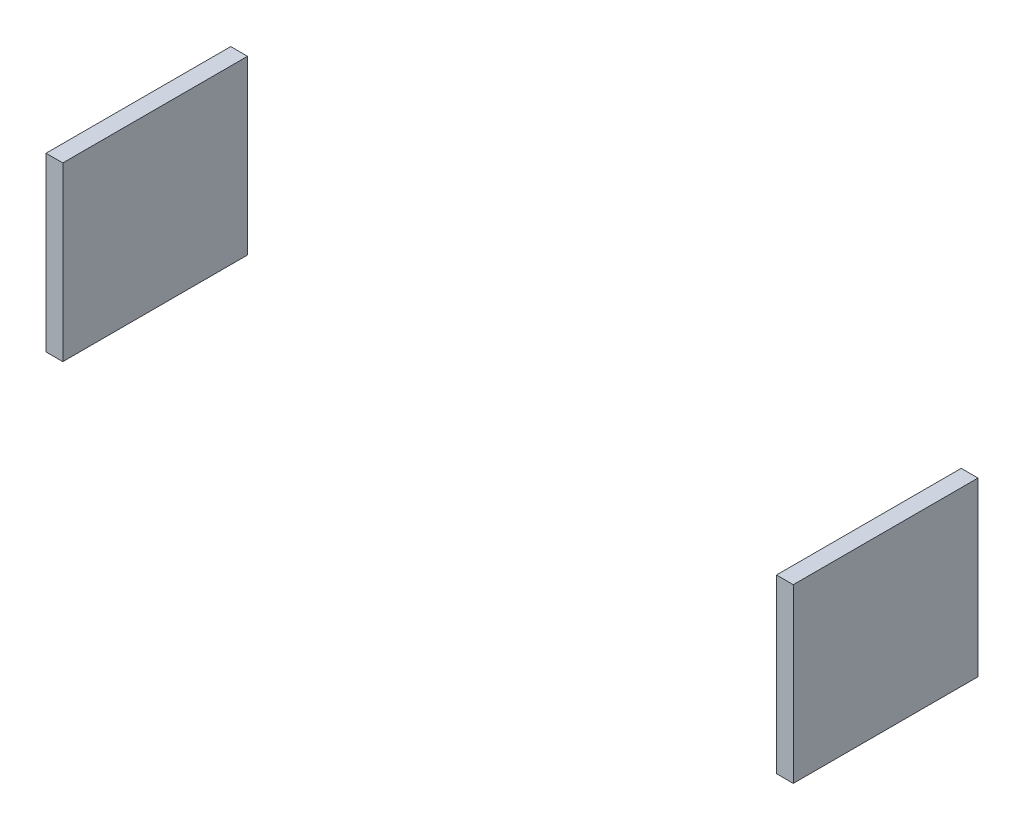
ISO-10303-21;
HEADER;
FILE_DESCRIPTION(('STEP AP214'),'2;1');
FILE_NAME('part.step','',(''),(''),'','','');
FILE_SCHEMA(('AUTOMOTIVE_DESIGN { 1 0 10303 214 1 1 1 1 }'));
ENDSEC;
DATA;
#1=APPLICATION_CONTEXT('core data for automotive mechanical design processes');
#2=APPLICATION_PROTOCOL_DEFINITION('international standard','automotive_design',2000,#1);
#3=PRODUCT_CONTEXT('',#1,'mechanical');
#4=PRODUCT('Part','Part','',(#3));
#5=PRODUCT_RELATED_PRODUCT_CATEGORY('part','',(#4));
#6=PRODUCT_DEFINITION_FORMATION('','',#4);
#7=PRODUCT_DEFINITION_CONTEXT('part definition',#1,'design');
#8=PRODUCT_DEFINITION('design','',#6,#7);
#9=PRODUCT_DEFINITION_SHAPE('','',#8);
#10=(LENGTH_UNIT() NAMED_UNIT(*) SI_UNIT(.MILLI.,.METRE.));
#11=(NAMED_UNIT(*) PLANE_ANGLE_UNIT() SI_UNIT($,.RADIAN.));
#12=(NAMED_UNIT(*) SI_UNIT($,.STERADIAN.) SOLID_ANGLE_UNIT());
#13=UNCERTAINTY_MEASURE_WITH_UNIT(LENGTH_MEASURE(1.E-05),#10,'distance_accuracy_value','');
#14=(GEOMETRIC_REPRESENTATION_CONTEXT(3) GLOBAL_UNCERTAINTY_ASSIGNED_CONTEXT((#13)) GLOBAL_UNIT_ASSIGNED_CONTEXT((#10,
#11,#12)) REPRESENTATION_CONTEXT('',''));
#15=CARTESIAN_POINT('',(0.,0.,0.));
#16=DIRECTION('',(0.,0.,1.));
#17=DIRECTION('',(1.,0.,0.));
#18=AXIS2_PLACEMENT_3D('',#15,#16,#17);
#19=CARTESIAN_POINT('',(-9.2,0.6,4.05));
#20=DIRECTION('',(1.,0.,0.));
#21=DIRECTION('',(0.,0.,-1.));
#22=AXIS2_PLACEMENT_3D('',#19,#20,#21);
#23=PLANE('',#22);
#24=DIRECTION('',(0.,0.,1.));
#25=VECTOR('',#24,1.);
#26=CARTESIAN_POINT('',(-9.2,1.95,4.05));
#27=LINE('',#26,#25);
#28=CARTESIAN_POINT('',(-9.2,1.95,1.85));
#29=VERTEX_POINT('',#28);
#30=CARTESIAN_POINT('',(-9.2,1.95,4.05));
#31=VERTEX_POINT('',#30);
#32=EDGE_CURVE('P0_E80',#29,#31,#27,.T.);
#33=ORIENTED_EDGE('',*,*,#32,.F.);
#34=DIRECTION('',(0.,1.,0.));
#35=VECTOR('',#34,1.);
#36=CARTESIAN_POINT('',(-9.2,-0.1,1.85));
#37=LINE('',#36,#35);
#38=CARTESIAN_POINT('',(-9.2,-0.0999999999999999,1.85));
#39=VERTEX_POINT('',#38);
#40=EDGE_CURVE('P0_E68',#39,#29,#37,.T.);
#41=ORIENTED_EDGE('',*,*,#40,.F.);
#42=DIRECTION('',(0.,0.,-1.));
#43=VECTOR('',#42,1.);
#44=CARTESIAN_POINT('',(-9.2,-0.1,4.05));
#45=LINE('',#44,#43);
#46=CARTESIAN_POINT('',(-9.2,-0.1,4.05));
#47=VERTEX_POINT('',#46);
#48=EDGE_CURVE('P0_E55',#47,#39,#45,.T.);
#49=ORIENTED_EDGE('',*,*,#48,.F.);
#50=DIRECTION('',(0.,1.,0.));
#51=VECTOR('',#50,1.);
#52=CARTESIAN_POINT('',(-9.2,0.,4.05));
#53=LINE('',#52,#51);
#54=EDGE_CURVE('P0_E20',#31,#47,#53,.F.);
#55=ORIENTED_EDGE('',*,*,#54,.F.);
#56=EDGE_LOOP('',(#33,#41,#49,#55));
#57=FACE_BOUND('',#56,.T.);
#58=ADVANCED_FACE('P0_F17',(#57),#23,.F.);
#59=CARTESIAN_POINT('',(0.,0.,4.05));
#60=DIRECTION('',(0.,0.,1.));
#61=DIRECTION('',(1.,0.,0.));
#62=AXIS2_PLACEMENT_3D('',#59,#60,#61);
#63=PLANE('',#62);
#64=DIRECTION('',(1.,0.,0.));
#65=VECTOR('',#64,1.);
#66=CARTESIAN_POINT('',(-9.2,-0.1,4.05));
#67=LINE('',#66,#65);
#68=CARTESIAN_POINT('',(-9.,-0.1,4.05));
#69=VERTEX_POINT('',#68);
#70=EDGE_CURVE('P0_E61',#69,#47,#67,.F.);
#71=ORIENTED_EDGE('',*,*,#70,.F.);
#72=DIRECTION('',(0.,1.,0.));
#73=VECTOR('',#72,1.);
#74=CARTESIAN_POINT('',(-9.,0.6,4.05));
#75=LINE('',#74,#73);
#76=CARTESIAN_POINT('',(-9.,1.95,4.05));
#77=VERTEX_POINT('',#76);
#78=EDGE_CURVE('P0_E83',#77,#69,#75,.F.);
#79=ORIENTED_EDGE('',*,*,#78,.F.);
#80=DIRECTION('',(1.,0.,0.));
#81=VECTOR('',#80,1.);
#82=CARTESIAN_POINT('',(-9.2,1.95,4.05));
#83=LINE('',#82,#81);
#84=EDGE_CURVE('P0_E64',#31,#77,#83,.T.);
#85=ORIENTED_EDGE('',*,*,#84,.F.);
#86=ORIENTED_EDGE('',*,*,#54,.T.);
#87=EDGE_LOOP('',(#71,#79,#85,#86));
#88=FACE_BOUND('',#87,.T.);
#89=ADVANCED_FACE('P0_F60',(#88),#63,.T.);
#90=CARTESIAN_POINT('',(-9.2,-0.1,4.05));
#91=DIRECTION('',(0.,-1.,0.));
#92=DIRECTION('',(0.,0.,-1.));
#93=AXIS2_PLACEMENT_3D('',#90,#91,#92);
#94=PLANE('',#93);
#95=ORIENTED_EDGE('',*,*,#48,.T.);
#96=DIRECTION('',(1.,0.,0.));
#97=VECTOR('',#96,1.);
#98=CARTESIAN_POINT('',(-9.2,-0.1,1.85));
#99=LINE('',#98,#97);
#100=CARTESIAN_POINT('',(-9.,-0.0999999999999999,1.85));
#101=VERTEX_POINT('',#100);
#102=EDGE_CURVE('P0_E70',#101,#39,#99,.F.);
#103=ORIENTED_EDGE('',*,*,#102,.F.);
#104=DIRECTION('',(0.,0.,-1.));
#105=VECTOR('',#104,1.);
#106=CARTESIAN_POINT('',(-9.,-0.1,4.05));
#107=LINE('',#106,#105);
#108=EDGE_CURVE('P0_E74',#69,#101,#107,.T.);
#109=ORIENTED_EDGE('',*,*,#108,.F.);
#110=ORIENTED_EDGE('',*,*,#70,.T.);
#111=EDGE_LOOP('',(#95,#103,#109,#110));
#112=FACE_BOUND('',#111,.T.);
#113=ADVANCED_FACE('P0_F72',(#112),#94,.T.);
#114=CARTESIAN_POINT('',(-9.2,-0.1,1.85));
#115=DIRECTION('',(0.,0.,-1.));
#116=DIRECTION('',(0.,1.,0.));
#117=AXIS2_PLACEMENT_3D('',#114,#115,#116);
#118=PLANE('',#117);
#119=ORIENTED_EDGE('',*,*,#40,.T.);
#120=DIRECTION('',(1.,0.,0.));
#121=VECTOR('',#120,1.);
#122=CARTESIAN_POINT('',(-9.2,1.95,1.85));
#123=LINE('',#122,#121);
#124=CARTESIAN_POINT('',(-9.,1.95,1.85));
#125=VERTEX_POINT('',#124);
#126=EDGE_CURVE('P0_E35',#125,#29,#123,.F.);
#127=ORIENTED_EDGE('',*,*,#126,.F.);
#128=DIRECTION('',(0.,1.,0.));
#129=VECTOR('',#128,1.);
#130=CARTESIAN_POINT('',(-9.,0.6,1.85));
#131=LINE('',#130,#129);
#132=EDGE_CURVE('P0_E26',#101,#125,#131,.T.);
#133=ORIENTED_EDGE('',*,*,#132,.F.);
#134=ORIENTED_EDGE('',*,*,#102,.T.);
#135=EDGE_LOOP('',(#119,#127,#133,#134));
#136=FACE_BOUND('',#135,.T.);
#137=ADVANCED_FACE('P0_F89',(#136),#118,.T.);
#138=CARTESIAN_POINT('',(-9.2,1.95,4.05));
#139=DIRECTION('',(0.,1.,0.));
#140=DIRECTION('',(0.,0.,1.));
#141=AXIS2_PLACEMENT_3D('',#138,#139,#140);
#142=PLANE('',#141);
#143=ORIENTED_EDGE('',*,*,#84,.T.);
#144=DIRECTION('',(0.,0.,-1.));
#145=VECTOR('',#144,1.);
#146=CARTESIAN_POINT('',(-9.,1.95,4.05));
#147=LINE('',#146,#145);
#148=EDGE_CURVE('P0_E11',#125,#77,#147,.F.);
#149=ORIENTED_EDGE('',*,*,#148,.F.);
#150=ORIENTED_EDGE('',*,*,#126,.T.);
#151=ORIENTED_EDGE('',*,*,#32,.T.);
#152=EDGE_LOOP('',(#143,#149,#150,#151));
#153=FACE_BOUND('',#152,.T.);
#154=ADVANCED_FACE('P0_F91',(#153),#142,.T.);
#155=CARTESIAN_POINT('',(-9.,0.6,4.05));
#156=DIRECTION('',(1.,0.,0.));
#157=DIRECTION('',(0.,0.,-1.));
#158=AXIS2_PLACEMENT_3D('',#155,#156,#157);
#159=PLANE('',#158);
#160=ORIENTED_EDGE('',*,*,#132,.T.);
#161=ORIENTED_EDGE('',*,*,#148,.T.);
#162=ORIENTED_EDGE('',*,*,#78,.T.);
#163=ORIENTED_EDGE('',*,*,#108,.T.);
#164=EDGE_LOOP('',(#160,#161,#162,#163));
#165=FACE_BOUND('',#164,.T.);
#166=ADVANCED_FACE('P0_F88',(#165),#159,.T.);
#167=CLOSED_SHELL('',(#58,#89,#113,#137,#154,#166));
#168=MANIFOLD_SOLID_BREP('P0_B1',#167);
#169=CARTESIAN_POINT('',(-0.3,0.6,4.05));
#170=DIRECTION('',(-1.,0.,0.));
#171=DIRECTION('',(0.,0.,1.));
#172=AXIS2_PLACEMENT_3D('',#169,#170,#171);
#173=PLANE('',#172);
#174=DIRECTION('',(0.,0.,1.));
#175=VECTOR('',#174,1.);
#176=CARTESIAN_POINT('',(-0.3,-0.1,4.05));
#177=LINE('',#176,#175);
#178=CARTESIAN_POINT('',(-0.3,-0.1,4.05));
#179=VERTEX_POINT('',#178);
#180=CARTESIAN_POINT('',(-0.3,-0.1,1.85));
#181=VERTEX_POINT('',#180);
#182=EDGE_CURVE('P1_E55',#179,#181,#177,.F.);
#183=ORIENTED_EDGE('',*,*,#182,.T.);
#184=DIRECTION('',(0.,-1.,0.));
#185=VECTOR('',#184,1.);
#186=CARTESIAN_POINT('',(-0.3,-0.1,1.85));
#187=LINE('',#186,#185);
#188=CARTESIAN_POINT('',(-0.3,1.95,1.85));
#189=VERTEX_POINT('',#188);
#190=EDGE_CURVE('P1_E20',#181,#189,#187,.F.);
#191=ORIENTED_EDGE('',*,*,#190,.T.);
#192=DIRECTION('',(0.,0.,1.));
#193=VECTOR('',#192,1.);
#194=CARTESIAN_POINT('',(-0.3,1.95,4.05));
#195=LINE('',#194,#193);
#196=CARTESIAN_POINT('',(-0.3,1.95,4.05));
#197=VERTEX_POINT('',#196);
#198=EDGE_CURVE('P1_E81',#197,#189,#195,.F.);
#199=ORIENTED_EDGE('',*,*,#198,.F.);
#200=DIRECTION('',(0.,1.,0.));
#201=VECTOR('',#200,1.);
#202=CARTESIAN_POINT('',(-0.3,0.,4.05));
#203=LINE('',#202,#201);
#204=EDGE_CURVE('P1_E61',#179,#197,#203,.T.);
#205=ORIENTED_EDGE('',*,*,#204,.F.);
#206=EDGE_LOOP('',(#183,#191,#199,#205));
#207=FACE_BOUND('',#206,.T.);
#208=ADVANCED_FACE('P1_F17',(#207),#173,.F.);
#209=CARTESIAN_POINT('',(-0.3,-0.1,1.85));
#210=DIRECTION('',(0.,0.,1.));
#211=DIRECTION('',(0.,-1.,0.));
#212=AXIS2_PLACEMENT_3D('',#209,#210,#211);
#213=PLANE('',#212);
#214=DIRECTION('',(1.,0.,0.));
#215=VECTOR('',#214,1.);
#216=CARTESIAN_POINT('',(-0.5,1.95,1.85));
#217=LINE('',#216,#215);
#218=CARTESIAN_POINT('',(-0.5,1.95,1.85));
#219=VERTEX_POINT('',#218);
#220=EDGE_CURVE('P1_E68',#189,#219,#217,.F.);
#221=ORIENTED_EDGE('',*,*,#220,.F.);
#222=ORIENTED_EDGE('',*,*,#190,.F.);
#223=DIRECTION('',(1.,0.,0.));
#224=VECTOR('',#223,1.);
#225=CARTESIAN_POINT('',(-0.3,-0.0999999999999998,1.85));
#226=LINE('',#225,#224);
#227=CARTESIAN_POINT('',(-0.5,-0.1,1.85));
#228=VERTEX_POINT('',#227);
#229=EDGE_CURVE('P1_E63',#181,#228,#226,.F.);
#230=ORIENTED_EDGE('',*,*,#229,.T.);
#231=DIRECTION('',(0.,1.,0.));
#232=VECTOR('',#231,1.);
#233=CARTESIAN_POINT('',(-0.5,0.6,1.85));
#234=LINE('',#233,#232);
#235=EDGE_CURVE('P1_E83',#219,#228,#234,.F.);
#236=ORIENTED_EDGE('',*,*,#235,.F.);
#237=EDGE_LOOP('',(#221,#222,#230,#236));
#238=FACE_BOUND('',#237,.T.);
#239=ADVANCED_FACE('P1_F65',(#238),#213,.F.);
#240=CARTESIAN_POINT('',(-0.3,-0.1,4.05));
#241=DIRECTION('',(0.,1.,0.));
#242=DIRECTION('',(0.,0.,1.));
#243=AXIS2_PLACEMENT_3D('',#240,#241,#242);
#244=PLANE('',#243);
#245=ORIENTED_EDGE('',*,*,#229,.F.);
#246=ORIENTED_EDGE('',*,*,#182,.F.);
#247=DIRECTION('',(1.,0.,0.));
#248=VECTOR('',#247,1.);
#249=CARTESIAN_POINT('',(0.,-0.1,4.05));
#250=LINE('',#249,#248);
#251=CARTESIAN_POINT('',(-0.5,-0.1,4.05));
#252=VERTEX_POINT('',#251);
#253=EDGE_CURVE('P1_E74',#252,#179,#250,.T.);
#254=ORIENTED_EDGE('',*,*,#253,.F.);
#255=DIRECTION('',(0.,0.,1.));
#256=VECTOR('',#255,1.);
#257=CARTESIAN_POINT('',(-0.5,-0.1,4.05));
#258=LINE('',#257,#256);
#259=EDGE_CURVE('P1_E72',#228,#252,#258,.T.);
#260=ORIENTED_EDGE('',*,*,#259,.F.);
#261=EDGE_LOOP('',(#245,#246,#254,#260));
#262=FACE_BOUND('',#261,.T.);
#263=ADVANCED_FACE('P1_F70',(#262),#244,.F.);
#264=CARTESIAN_POINT('',(0.,0.,4.05));
#265=DIRECTION('',(0.,0.,1.));
#266=DIRECTION('',(1.,0.,0.));
#267=AXIS2_PLACEMENT_3D('',#264,#265,#266);
#268=PLANE('',#267);
#269=ORIENTED_EDGE('',*,*,#204,.T.);
#270=DIRECTION('',(1.,0.,0.));
#271=VECTOR('',#270,1.);
#272=CARTESIAN_POINT('',(-0.5,1.95,4.05));
#273=LINE('',#272,#271);
#274=CARTESIAN_POINT('',(-0.5,1.95,4.05));
#275=VERTEX_POINT('',#274);
#276=EDGE_CURVE('P1_E35',#275,#197,#273,.T.);
#277=ORIENTED_EDGE('',*,*,#276,.F.);
#278=DIRECTION('',(0.,1.,0.));
#279=VECTOR('',#278,1.);
#280=CARTESIAN_POINT('',(-0.5,0.6,4.05));
#281=LINE('',#280,#279);
#282=EDGE_CURVE('P1_E26',#252,#275,#281,.T.);
#283=ORIENTED_EDGE('',*,*,#282,.F.);
#284=ORIENTED_EDGE('',*,*,#253,.T.);
#285=EDGE_LOOP('',(#269,#277,#283,#284));
#286=FACE_BOUND('',#285,.T.);
#287=ADVANCED_FACE('P1_F89',(#286),#268,.T.);
#288=CARTESIAN_POINT('',(-0.5,1.95,4.05));
#289=DIRECTION('',(0.,1.,0.));
#290=DIRECTION('',(0.,0.,1.));
#291=AXIS2_PLACEMENT_3D('',#288,#289,#290);
#292=PLANE('',#291);
#293=ORIENTED_EDGE('',*,*,#276,.T.);
#294=ORIENTED_EDGE('',*,*,#198,.T.);
#295=ORIENTED_EDGE('',*,*,#220,.T.);
#296=DIRECTION('',(0.,0.,1.));
#297=VECTOR('',#296,1.);
#298=CARTESIAN_POINT('',(-0.5,1.95,4.05));
#299=LINE('',#298,#297);
#300=EDGE_CURVE('P1_E11',#275,#219,#299,.F.);
#301=ORIENTED_EDGE('',*,*,#300,.F.);
#302=EDGE_LOOP('',(#293,#294,#295,#301));
#303=FACE_BOUND('',#302,.T.);
#304=ADVANCED_FACE('P1_F91',(#303),#292,.T.);
#305=CARTESIAN_POINT('',(-0.5,0.6,4.05));
#306=DIRECTION('',(-1.,0.,0.));
#307=DIRECTION('',(0.,0.,1.));
#308=AXIS2_PLACEMENT_3D('',#305,#306,#307);
#309=PLANE('',#308);
#310=ORIENTED_EDGE('',*,*,#282,.T.);
#311=ORIENTED_EDGE('',*,*,#300,.T.);
#312=ORIENTED_EDGE('',*,*,#235,.T.);
#313=ORIENTED_EDGE('',*,*,#259,.T.);
#314=EDGE_LOOP('',(#310,#311,#312,#313));
#315=FACE_BOUND('',#314,.T.);
#316=ADVANCED_FACE('P1_F88',(#315),#309,.T.);
#317=CLOSED_SHELL('',(#208,#239,#263,#287,#304,#316));
#318=MANIFOLD_SOLID_BREP('P1_B1',#317);
#319=ADVANCED_BREP_SHAPE_REPRESENTATION('',(#18,#168,#318),#14);
#320=SHAPE_DEFINITION_REPRESENTATION(#9,#319);
ENDSEC;
END-ISO-10303-21;
